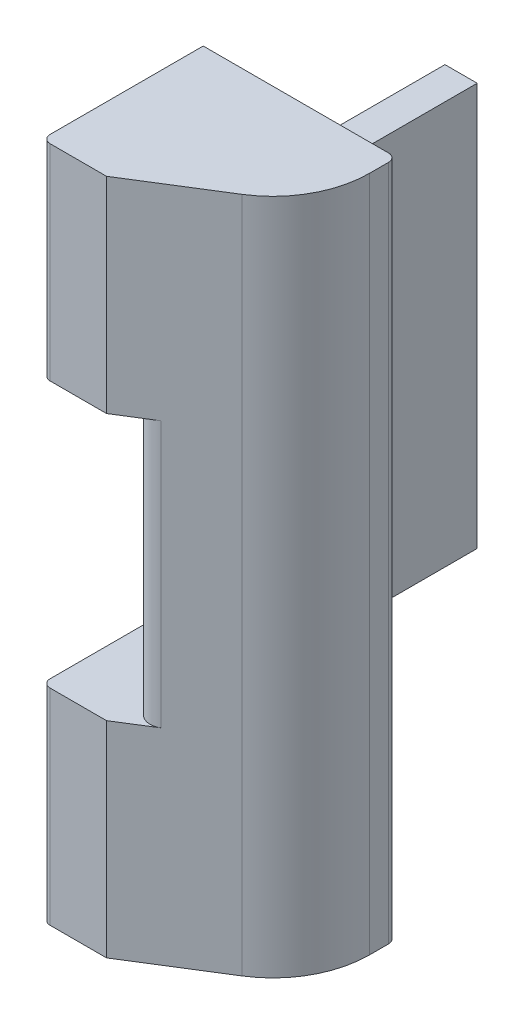
ISO-10303-21;
HEADER;
FILE_DESCRIPTION(('STEP AP214'),'2;1');
FILE_NAME('part.step','',(''),(''),'','','');
FILE_SCHEMA(('AUTOMOTIVE_DESIGN { 1 0 10303 214 1 1 1 1 }'));
ENDSEC;
DATA;
#1=APPLICATION_CONTEXT('core data for automotive mechanical design processes');
#2=APPLICATION_PROTOCOL_DEFINITION('international standard','automotive_design',2000,#1);
#3=PRODUCT_CONTEXT('',#1,'mechanical');
#4=PRODUCT('Part','Part','',(#3));
#5=PRODUCT_RELATED_PRODUCT_CATEGORY('part','',(#4));
#6=PRODUCT_DEFINITION_FORMATION('','',#4);
#7=PRODUCT_DEFINITION_CONTEXT('part definition',#1,'design');
#8=PRODUCT_DEFINITION('design','',#6,#7);
#9=PRODUCT_DEFINITION_SHAPE('','',#8);
#10=(LENGTH_UNIT() NAMED_UNIT(*) SI_UNIT(.MILLI.,.METRE.));
#11=(NAMED_UNIT(*) PLANE_ANGLE_UNIT() SI_UNIT($,.RADIAN.));
#12=(NAMED_UNIT(*) SI_UNIT($,.STERADIAN.) SOLID_ANGLE_UNIT());
#13=UNCERTAINTY_MEASURE_WITH_UNIT(LENGTH_MEASURE(1.E-05),#10,'distance_accuracy_value','');
#14=(GEOMETRIC_REPRESENTATION_CONTEXT(3) GLOBAL_UNCERTAINTY_ASSIGNED_CONTEXT((#13)) GLOBAL_UNIT_ASSIGNED_CONTEXT((#10,
#11,#12)) REPRESENTATION_CONTEXT('',''));
#15=CARTESIAN_POINT('',(0.,0.,0.));
#16=DIRECTION('',(0.,0.,1.));
#17=DIRECTION('',(1.,0.,0.));
#18=AXIS2_PLACEMENT_3D('',#15,#16,#17);
#19=CARTESIAN_POINT('',(0.,0.,0.));
#20=DIRECTION('',(0.,0.,-1.));
#21=DIRECTION('',(-1.,0.,0.));
#22=AXIS2_PLACEMENT_3D('',#19,#20,#21);
#23=PLANE('',#22);
#24=DIRECTION('',(-1.,0.,0.));
#25=VECTOR('',#24,1.);
#26=CARTESIAN_POINT('',(-5.99999999999999,-8.25,0.));
#27=LINE('',#26,#25);
#28=CARTESIAN_POINT('',(5.50000000000001,-8.25000000000001,0.));
#29=VERTEX_POINT('',#28);
#30=CARTESIAN_POINT('',(2.00000000000001,-8.25,0.));
#31=VERTEX_POINT('',#30);
#32=EDGE_CURVE('E50',#29,#31,#27,.T.);
#33=ORIENTED_EDGE('',*,*,#32,.F.);
#34=DIRECTION('',(0.,1.,0.));
#35=VECTOR('',#34,1.);
#36=CARTESIAN_POINT('',(5.50000000000001,-21.,0.));
#37=LINE('',#36,#35);
#38=CARTESIAN_POINT('',(5.50000000000001,-21.,0.));
#39=VERTEX_POINT('',#38);
#40=EDGE_CURVE('E304',#29,#39,#37,.F.);
#41=ORIENTED_EDGE('',*,*,#40,.T.);
#42=DIRECTION('',(1.,0.,0.));
#43=VECTOR('',#42,1.);
#44=CARTESIAN_POINT('',(-5.99999999999999,-21.,0.));
#45=LINE('',#44,#43);
#46=CARTESIAN_POINT('',(-5.99999999999999,-21.,0.));
#47=VERTEX_POINT('',#46);
#48=EDGE_CURVE('E281',#47,#39,#45,.T.);
#49=ORIENTED_EDGE('',*,*,#48,.F.);
#50=DIRECTION('',(0.,-1.,0.));
#51=VECTOR('',#50,1.);
#52=CARTESIAN_POINT('',(-5.99999999999999,-21.,0.));
#53=LINE('',#52,#51);
#54=CARTESIAN_POINT('',(-5.99999999999999,-14.5,0.));
#55=VERTEX_POINT('',#54);
#56=EDGE_CURVE('E279',#55,#47,#53,.T.);
#57=ORIENTED_EDGE('',*,*,#56,.F.);
#58=DIRECTION('',(-1.,0.,0.));
#59=VECTOR('',#58,1.);
#60=CARTESIAN_POINT('',(0.,-14.5,0.));
#61=LINE('',#60,#59);
#62=CARTESIAN_POINT('',(2.00000000000001,-14.5,0.));
#63=VERTEX_POINT('',#62);
#64=EDGE_CURVE('E349',#55,#63,#61,.F.);
#65=ORIENTED_EDGE('',*,*,#64,.T.);
#66=DIRECTION('',(0.,-1.,0.));
#67=VECTOR('',#66,1.);
#68=CARTESIAN_POINT('',(2.00000000000001,-8.25,0.));
#69=LINE('',#68,#67);
#70=EDGE_CURVE('E336',#63,#31,#69,.F.);
#71=ORIENTED_EDGE('',*,*,#70,.T.);
#72=EDGE_LOOP('',(#33,#41,#49,#57,#65,#71));
#73=FACE_BOUND('',#72,.T.);
#74=ADVANCED_FACE('F34',(#73),#23,.T.);
#75=CARTESIAN_POINT('',(-1.99999999999999,30.,10.));
#76=DIRECTION('',(0.52999894000318,0.,0.847998304005088));
#77=DIRECTION('',(0.847998304005088,0.,-0.52999894000318));
#78=AXIS2_PLACEMENT_3D('',#75,#76,#77);
#79=PLANE('',#78);
#80=DIRECTION('',(0.,-1.,0.));
#81=VECTOR('',#80,1.);
#82=CARTESIAN_POINT('',(0.0868344256533013,30.,8.69572848396669));
#83=LINE('',#82,#81);
#84=CARTESIAN_POINT('',(0.0868344256533013,8.25000000000003,8.69572848396669));
#85=VERTEX_POINT('',#84);
#86=CARTESIAN_POINT('',(0.0868344256533012,-8.25,8.69572848396669));
#87=VERTEX_POINT('',#86);
#88=EDGE_CURVE('E238',#85,#87,#83,.T.);
#89=ORIENTED_EDGE('',*,*,#88,.T.);
#90=DIRECTION('',(-0.847998304005088,0.,0.52999894000318));
#91=VECTOR('',#90,1.);
#92=CARTESIAN_POINT('',(-1.99999999999999,-8.25,10.));
#93=LINE('',#92,#91);
#94=CARTESIAN_POINT('',(-1.99999999999999,-8.25,10.));
#95=VERTEX_POINT('',#94);
#96=EDGE_CURVE('E231',#87,#95,#93,.T.);
#97=ORIENTED_EDGE('',*,*,#96,.T.);
#98=DIRECTION('',(0.,-1.,0.));
#99=VECTOR('',#98,1.);
#100=CARTESIAN_POINT('',(-1.99999999999999,0.,10.));
#101=LINE('',#100,#99);
#102=CARTESIAN_POINT('',(-1.99999999999999,-21.,10.));
#103=VERTEX_POINT('',#102);
#104=EDGE_CURVE('E235',#95,#103,#101,.T.);
#105=ORIENTED_EDGE('',*,*,#104,.T.);
#106=DIRECTION('',(0.847998304005088,0.,-0.52999894000318));
#107=VECTOR('',#106,1.);
#108=CARTESIAN_POINT('',(-4.87640449438202,-21.,11.7977528089888));
#109=LINE('',#108,#107);
#110=CARTESIAN_POINT('',(3.17999364001909,-21.,6.76250397498808));
#111=VERTEX_POINT('',#110);
#112=EDGE_CURVE('E459',#103,#111,#109,.T.);
#113=ORIENTED_EDGE('',*,*,#112,.T.);
#114=DIRECTION('',(0.,-1.,0.));
#115=VECTOR('',#114,1.);
#116=CARTESIAN_POINT('',(3.17999364001909,21.,6.76250397498807));
#117=LINE('',#116,#115);
#118=CARTESIAN_POINT('',(3.17999364001909,21.,6.76250397498808));
#119=VERTEX_POINT('',#118);
#120=EDGE_CURVE('E402',#111,#119,#117,.F.);
#121=ORIENTED_EDGE('',*,*,#120,.T.);
#122=DIRECTION('',(-0.847998304005088,0.,0.52999894000318));
#123=VECTOR('',#122,1.);
#124=CARTESIAN_POINT('',(-4.87640449438202,21.,11.7977528089888));
#125=LINE('',#124,#123);
#126=CARTESIAN_POINT('',(-1.99999999999999,21.,10.));
#127=VERTEX_POINT('',#126);
#128=EDGE_CURVE('E270',#119,#127,#125,.T.);
#129=ORIENTED_EDGE('',*,*,#128,.T.);
#130=CARTESIAN_POINT('',(-1.99999999999999,8.25000000000003,10.));
#131=VERTEX_POINT('',#130);
#132=EDGE_CURVE('E249',#127,#131,#101,.T.);
#133=ORIENTED_EDGE('',*,*,#132,.T.);
#134=DIRECTION('',(0.847998304005088,0.,-0.52999894000318));
#135=VECTOR('',#134,1.);
#136=CARTESIAN_POINT('',(-1.99999999999999,8.25000000000003,10.));
#137=LINE('',#136,#135);
#138=EDGE_CURVE('E240',#131,#85,#137,.T.);
#139=ORIENTED_EDGE('',*,*,#138,.T.);
#140=EDGE_LOOP('',(#89,#97,#105,#113,#121,#129,#133,#139));
#141=FACE_BOUND('',#140,.T.);
#142=ADVANCED_FACE('F233',(#141),#79,.T.);
#143=CARTESIAN_POINT('',(-1.99999999999999,8.25,9.));
#144=DIRECTION('',(-0.543627400818268,0.,-0.83932666410616));
#145=DIRECTION('',(-0.83932666410616,0.,0.543627400818268));
#146=AXIS2_PLACEMENT_3D('',#143,#144,#145);
#147=PLANE('',#146);
#148=DIRECTION('',(0.83932666410616,0.,-0.543627400818268));
#149=VECTOR('',#148,1.);
#150=CARTESIAN_POINT('',(-1.99999999999999,-8.25,9.));
#151=LINE('',#150,#149);
#152=CARTESIAN_POINT('',(-0.986791915168148,-8.25,8.34375053099049));
#153=VERTEX_POINT('',#152);
#154=CARTESIAN_POINT('',(4.54362740081827,-8.25,4.76172745611702));
#155=VERTEX_POINT('',#154);
#156=EDGE_CURVE('E559',#153,#155,#151,.T.);
#157=ORIENTED_EDGE('',*,*,#156,.F.);
#158=DIRECTION('',(0.,1.,0.));
#159=VECTOR('',#158,1.);
#160=CARTESIAN_POINT('',(-0.986791915168148,8.25,8.34375053099049));
#161=LINE('',#160,#159);
#162=CARTESIAN_POINT('',(-0.986791915168148,8.25,8.34375053099049));
#163=VERTEX_POINT('',#162);
#164=EDGE_CURVE('E409',#153,#163,#161,.T.);
#165=ORIENTED_EDGE('',*,*,#164,.T.);
#166=DIRECTION('',(0.83932666410616,0.,-0.543627400818268));
#167=VECTOR('',#166,1.);
#168=CARTESIAN_POINT('',(-1.99999999999999,8.25,9.));
#169=LINE('',#168,#167);
#170=CARTESIAN_POINT('',(4.54362740081827,8.25,4.76172745611702));
#171=VERTEX_POINT('',#170);
#172=EDGE_CURVE('E460',#163,#171,#169,.T.);
#173=ORIENTED_EDGE('',*,*,#172,.T.);
#174=DIRECTION('',(0.,-1.,0.));
#175=VECTOR('',#174,1.);
#176=CARTESIAN_POINT('',(4.54362740081828,-8.24999999999999,4.76172745611702));
#177=LINE('',#176,#175);
#178=EDGE_CURVE('E406',#171,#155,#177,.T.);
#179=ORIENTED_EDGE('',*,*,#178,.T.);
#180=EDGE_LOOP('',(#157,#165,#173,#179));
#181=FACE_BOUND('',#180,.T.);
#182=ADVANCED_FACE('F564',(#181),#147,.T.);
#183=CARTESIAN_POINT('',(5.50000000000001,21.,0.));
#184=VERTEX_POINT('',#183);
#185=CARTESIAN_POINT('',(5.50000000000001,8.25000000000003,0.));
#186=VERTEX_POINT('',#185);
#187=EDGE_CURVE('E305',#184,#186,#37,.F.);
#188=ORIENTED_EDGE('',*,*,#187,.T.);
#189=DIRECTION('',(1.,0.,0.));
#190=VECTOR('',#189,1.);
#191=CARTESIAN_POINT('',(-2.,8.25000000000003,0.));
#192=LINE('',#191,#190);
#193=CARTESIAN_POINT('',(2.00000000000001,8.25000000000003,0.));
#194=VERTEX_POINT('',#193);
#195=EDGE_CURVE('E273',#194,#186,#192,.T.);
#196=ORIENTED_EDGE('',*,*,#195,.F.);
#197=DIRECTION('',(0.,-1.,0.));
#198=VECTOR('',#197,1.);
#199=CARTESIAN_POINT('',(2.00000000000001,12.5,0.));
#200=LINE('',#199,#198);
#201=CARTESIAN_POINT('',(2.00000000000001,14.5,0.));
#202=VERTEX_POINT('',#201);
#203=EDGE_CURVE('E338',#194,#202,#200,.F.);
#204=ORIENTED_EDGE('',*,*,#203,.T.);
#205=DIRECTION('',(-1.,0.,0.));
#206=VECTOR('',#205,1.);
#207=CARTESIAN_POINT('',(0.,14.5,0.));
#208=LINE('',#207,#206);
#209=CARTESIAN_POINT('',(-5.99999999999999,14.5,0.));
#210=VERTEX_POINT('',#209);
#211=EDGE_CURVE('E352',#202,#210,#208,.T.);
#212=ORIENTED_EDGE('',*,*,#211,.T.);
#213=DIRECTION('',(0.,-1.,0.));
#214=VECTOR('',#213,1.);
#215=CARTESIAN_POINT('',(-5.99999999999999,8.25000000000003,0.));
#216=LINE('',#215,#214);
#217=CARTESIAN_POINT('',(-5.99999999999999,21.,0.));
#218=VERTEX_POINT('',#217);
#219=EDGE_CURVE('E269',#218,#210,#216,.T.);
#220=ORIENTED_EDGE('',*,*,#219,.F.);
#221=DIRECTION('',(-1.,0.,0.));
#222=VECTOR('',#221,1.);
#223=CARTESIAN_POINT('',(-5.99999999999999,21.,0.));
#224=LINE('',#223,#222);
#225=EDGE_CURVE('E266',#184,#218,#224,.T.);
#226=ORIENTED_EDGE('',*,*,#225,.F.);
#227=EDGE_LOOP('',(#188,#196,#204,#212,#220,#226));
#228=FACE_BOUND('',#227,.T.);
#229=ADVANCED_FACE('F512',(#228),#23,.T.);
#230=CARTESIAN_POINT('',(6.00000000000001,-21.,10.));
#231=DIRECTION('',(-1.,0.,0.));
#232=DIRECTION('',(0.,0.,1.));
#233=AXIS2_PLACEMENT_3D('',#230,#231,#232);
#234=PLANE('',#233);
#235=DIRECTION('',(0.,0.,-1.));
#236=VECTOR('',#235,1.);
#237=CARTESIAN_POINT('',(6.00000000000001,21.,10.));
#238=LINE('',#237,#236);
#239=CARTESIAN_POINT('',(6.00000000000001,21.,1.67451415095755));
#240=VERTEX_POINT('',#239);
#241=CARTESIAN_POINT('',(6.00000000000001,21.,0.5));
#242=VERTEX_POINT('',#241);
#243=EDGE_CURVE('E250',#240,#242,#238,.T.);
#244=ORIENTED_EDGE('',*,*,#243,.F.);
#245=DIRECTION('',(0.,-1.,0.));
#246=VECTOR('',#245,1.);
#247=CARTESIAN_POINT('',(6.00000000000001,-21.,1.67451415095755));
#248=LINE('',#247,#246);
#249=CARTESIAN_POINT('',(6.00000000000001,-21.,1.67451415095755));
#250=VERTEX_POINT('',#249);
#251=EDGE_CURVE('E397',#240,#250,#248,.T.);
#252=ORIENTED_EDGE('',*,*,#251,.T.);
#253=DIRECTION('',(0.,0.,-1.));
#254=VECTOR('',#253,1.);
#255=CARTESIAN_POINT('',(6.00000000000001,-21.,10.));
#256=LINE('',#255,#254);
#257=CARTESIAN_POINT('',(6.00000000000001,-21.,0.5));
#258=VERTEX_POINT('',#257);
#259=EDGE_CURVE('E260',#250,#258,#256,.T.);
#260=ORIENTED_EDGE('',*,*,#259,.T.);
#261=DIRECTION('',(0.,1.,0.));
#262=VECTOR('',#261,1.);
#263=CARTESIAN_POINT('',(6.00000000000001,21.,0.5));
#264=LINE('',#263,#262);
#265=EDGE_CURVE('E297',#258,#242,#264,.T.);
#266=ORIENTED_EDGE('',*,*,#265,.T.);
#267=EDGE_LOOP('',(#244,#252,#260,#266));
#268=FACE_BOUND('',#267,.T.);
#269=ADVANCED_FACE('F520',(#268),#234,.F.);
#270=CARTESIAN_POINT('',(-5.99999999999999,21.,10.));
#271=DIRECTION('',(0.,-1.,0.));
#272=DIRECTION('',(0.,0.,-1.));
#273=AXIS2_PLACEMENT_3D('',#270,#271,#272);
#274=PLANE('',#273);
#275=ORIENTED_EDGE('',*,*,#128,.F.);
#276=CARTESIAN_POINT('',(0.,21.,1.67451415095755));
#277=DIRECTION('',(0.,-1.,0.));
#278=DIRECTION('',(0.,0.,-1.));
#279=AXIS2_PLACEMENT_3D('',#276,#277,#278);
#280=CIRCLE('',#279,6.);
#281=EDGE_CURVE('E404',#119,#240,#280,.F.);
#282=ORIENTED_EDGE('',*,*,#281,.T.);
#283=ORIENTED_EDGE('',*,*,#243,.T.);
#284=CARTESIAN_POINT('',(5.50000000000001,21.,0.5));
#285=DIRECTION('',(0.,-1.,0.));
#286=DIRECTION('',(0.,0.,-1.));
#287=AXIS2_PLACEMENT_3D('',#284,#285,#286);
#288=CIRCLE('',#287,0.5);
#289=EDGE_CURVE('E302',#242,#184,#288,.F.);
#290=ORIENTED_EDGE('',*,*,#289,.T.);
#291=ORIENTED_EDGE('',*,*,#225,.T.);
#292=DIRECTION('',(0.,0.,-1.));
#293=VECTOR('',#292,1.);
#294=CARTESIAN_POINT('',(-5.99999999999999,21.,10.));
#295=LINE('',#294,#293);
#296=CARTESIAN_POINT('',(-5.99999999999999,21.,9.5));
#297=VERTEX_POINT('',#296);
#298=EDGE_CURVE('E294',#297,#218,#295,.T.);
#299=ORIENTED_EDGE('',*,*,#298,.F.);
#300=CARTESIAN_POINT('',(-5.49999999999999,21.,9.5));
#301=DIRECTION('',(0.,-1.,0.));
#302=DIRECTION('',(0.,0.,-1.));
#303=AXIS2_PLACEMENT_3D('',#300,#301,#302);
#304=CIRCLE('',#303,0.5);
#305=CARTESIAN_POINT('',(-5.49999999999999,21.,10.));
#306=VERTEX_POINT('',#305);
#307=EDGE_CURVE('E300',#297,#306,#304,.F.);
#308=ORIENTED_EDGE('',*,*,#307,.T.);
#309=DIRECTION('',(-1.,0.,0.));
#310=VECTOR('',#309,1.);
#311=CARTESIAN_POINT('',(-5.99999999999999,21.,10.));
#312=LINE('',#311,#310);
#313=EDGE_CURVE('E262',#127,#306,#312,.T.);
#314=ORIENTED_EDGE('',*,*,#313,.F.);
#315=EDGE_LOOP('',(#275,#282,#283,#290,#291,#299,#308,#314));
#316=FACE_BOUND('',#315,.T.);
#317=ADVANCED_FACE('F594',(#316),#274,.F.);
#318=CARTESIAN_POINT('',(-5.99999999999999,-21.,10.));
#319=DIRECTION('',(0.,1.,0.));
#320=DIRECTION('',(0.,0.,1.));
#321=AXIS2_PLACEMENT_3D('',#318,#319,#320);
#322=PLANE('',#321);
#323=ORIENTED_EDGE('',*,*,#259,.F.);
#324=CARTESIAN_POINT('',(0.,-21.,1.67451415095755));
#325=DIRECTION('',(0.,1.,0.));
#326=DIRECTION('',(0.,0.,1.));
#327=AXIS2_PLACEMENT_3D('',#324,#325,#326);
#328=CIRCLE('',#327,6.);
#329=EDGE_CURVE('E400',#250,#111,#328,.F.);
#330=ORIENTED_EDGE('',*,*,#329,.T.);
#331=ORIENTED_EDGE('',*,*,#112,.F.);
#332=DIRECTION('',(1.,0.,0.));
#333=VECTOR('',#332,1.);
#334=CARTESIAN_POINT('',(-5.99999999999999,-21.,10.));
#335=LINE('',#334,#333);
#336=CARTESIAN_POINT('',(-5.49999999999999,-21.,10.));
#337=VERTEX_POINT('',#336);
#338=EDGE_CURVE('E248',#337,#103,#335,.T.);
#339=ORIENTED_EDGE('',*,*,#338,.F.);
#340=CARTESIAN_POINT('',(-5.49999999999999,-21.,9.5));
#341=DIRECTION('',(0.,1.,0.));
#342=DIRECTION('',(0.,0.,1.));
#343=AXIS2_PLACEMENT_3D('',#340,#341,#342);
#344=CIRCLE('',#343,0.5);
#345=CARTESIAN_POINT('',(-5.99999999999999,-21.,9.5));
#346=VERTEX_POINT('',#345);
#347=EDGE_CURVE('E308',#337,#346,#344,.F.);
#348=ORIENTED_EDGE('',*,*,#347,.T.);
#349=DIRECTION('',(0.,0.,-1.));
#350=VECTOR('',#349,1.);
#351=CARTESIAN_POINT('',(-5.99999999999999,-21.,10.));
#352=LINE('',#351,#350);
#353=EDGE_CURVE('E285',#346,#47,#352,.T.);
#354=ORIENTED_EDGE('',*,*,#353,.T.);
#355=ORIENTED_EDGE('',*,*,#48,.T.);
#356=CARTESIAN_POINT('',(5.50000000000001,-21.,0.5));
#357=DIRECTION('',(0.,1.,0.));
#358=DIRECTION('',(0.,0.,1.));
#359=AXIS2_PLACEMENT_3D('',#356,#357,#358);
#360=CIRCLE('',#359,0.5);
#361=EDGE_CURVE('E310',#39,#258,#360,.F.);
#362=ORIENTED_EDGE('',*,*,#361,.T.);
#363=EDGE_LOOP('',(#323,#330,#331,#339,#348,#354,#355,#362));
#364=FACE_BOUND('',#363,.T.);
#365=ADVANCED_FACE('F524',(#364),#322,.F.);
#366=CARTESIAN_POINT('',(0.,0.,10.));
#367=DIRECTION('',(0.,0.,-1.));
#368=DIRECTION('',(-1.,0.,0.));
#369=AXIS2_PLACEMENT_3D('',#366,#367,#368);
#370=PLANE('',#369);
#371=ORIENTED_EDGE('',*,*,#313,.T.);
#372=DIRECTION('',(0.,-1.,0.));
#373=VECTOR('',#372,1.);
#374=CARTESIAN_POINT('',(-5.49999999999999,0.,10.));
#375=LINE('',#374,#373);
#376=CARTESIAN_POINT('',(-5.49999999999999,8.25000000000003,10.));
#377=VERTEX_POINT('',#376);
#378=EDGE_CURVE('E318',#306,#377,#375,.T.);
#379=ORIENTED_EDGE('',*,*,#378,.T.);
#380=DIRECTION('',(1.,0.,0.));
#381=VECTOR('',#380,1.);
#382=CARTESIAN_POINT('',(-2.,8.25000000000003,10.));
#383=LINE('',#382,#381);
#384=EDGE_CURVE('E258',#377,#131,#383,.T.);
#385=ORIENTED_EDGE('',*,*,#384,.T.);
#386=ORIENTED_EDGE('',*,*,#132,.F.);
#387=EDGE_LOOP('',(#371,#379,#385,#386));
#388=FACE_BOUND('',#387,.T.);
#389=ADVANCED_FACE('F472',(#388),#370,.F.);
#390=DIRECTION('',(-1.,0.,0.));
#391=VECTOR('',#390,1.);
#392=CARTESIAN_POINT('',(-5.99999999999999,-8.25,10.));
#393=LINE('',#392,#391);
#394=CARTESIAN_POINT('',(-5.49999999999999,-8.25,10.));
#395=VERTEX_POINT('',#394);
#396=EDGE_CURVE('E245',#95,#395,#393,.T.);
#397=ORIENTED_EDGE('',*,*,#396,.T.);
#398=DIRECTION('',(0.,-1.,0.));
#399=VECTOR('',#398,1.);
#400=CARTESIAN_POINT('',(-5.49999999999999,0.,10.));
#401=LINE('',#400,#399);
#402=EDGE_CURVE('E313',#395,#337,#401,.T.);
#403=ORIENTED_EDGE('',*,*,#402,.T.);
#404=ORIENTED_EDGE('',*,*,#338,.T.);
#405=ORIENTED_EDGE('',*,*,#104,.F.);
#406=EDGE_LOOP('',(#397,#403,#404,#405));
#407=FACE_BOUND('',#406,.T.);
#408=ADVANCED_FACE('F243',(#407),#370,.F.);
#409=CARTESIAN_POINT('',(-2.,8.25000000000003,10.));
#410=DIRECTION('',(0.,1.,0.));
#411=DIRECTION('',(-1.,0.,0.));
#412=AXIS2_PLACEMENT_3D('',#409,#410,#411);
#413=PLANE('',#412);
#414=DIRECTION('',(0.,0.,-1.));
#415=VECTOR('',#414,1.);
#416=CARTESIAN_POINT('',(5.00000000000001,8.25,4.46613735930763));
#417=LINE('',#416,#415);
#418=CARTESIAN_POINT('',(5.00000000000001,8.25,3.92240079201086));
#419=VERTEX_POINT('',#418);
#420=CARTESIAN_POINT('',(5.00000000000001,8.25,1.));
#421=VERTEX_POINT('',#420);
#422=EDGE_CURVE('E454',#419,#421,#417,.T.);
#423=ORIENTED_EDGE('',*,*,#422,.F.);
#424=CARTESIAN_POINT('',(4.00000000000001,8.25000000000003,3.92240079201086));
#425=DIRECTION('',(0.,1.,0.));
#426=DIRECTION('',(-1.,0.,0.));
#427=AXIS2_PLACEMENT_3D('',#424,#425,#426);
#428=CIRCLE('',#427,1.);
#429=EDGE_CURVE('E420',#419,#171,#428,.F.);
#430=ORIENTED_EDGE('',*,*,#429,.T.);
#431=ORIENTED_EDGE('',*,*,#172,.F.);
#432=CARTESIAN_POINT('',(-0.443164514349879,8.25000000000003,9.18307719509665));
#433=DIRECTION('',(0.,1.,0.));
#434=DIRECTION('',(-1.,0.,0.));
#435=AXIS2_PLACEMENT_3D('',#432,#433,#434);
#436=CIRCLE('',#435,1.);
#437=CARTESIAN_POINT('',(-1.18761873543569,8.25000000000003,8.51540368752913));
#438=VERTEX_POINT('',#437);
#439=EDGE_CURVE('E431',#163,#438,#436,.T.);
#440=ORIENTED_EDGE('',*,*,#439,.T.);
#441=CARTESIAN_POINT('',(-0.443164514349879,8.25000000000003,7.8477301799616));
#442=DIRECTION('',(0.,1.,0.));
#443=DIRECTION('',(-1.,0.,0.));
#444=AXIS2_PLACEMENT_3D('',#441,#442,#443);
#445=CIRCLE('',#444,1.);
#446=EDGE_CURVE('E436',#438,#85,#445,.T.);
#447=ORIENTED_EDGE('',*,*,#446,.T.);
#448=ORIENTED_EDGE('',*,*,#138,.F.);
#449=ORIENTED_EDGE('',*,*,#384,.F.);
#450=CARTESIAN_POINT('',(-5.49999999999999,8.25000000000003,9.5));
#451=DIRECTION('',(0.,1.,0.));
#452=DIRECTION('',(-1.,0.,0.));
#453=AXIS2_PLACEMENT_3D('',#450,#451,#452);
#454=CIRCLE('',#453,0.5);
#455=CARTESIAN_POINT('',(-5.99999999999999,8.25000000000003,9.5));
#456=VERTEX_POINT('',#455);
#457=EDGE_CURVE('E321',#377,#456,#454,.F.);
#458=ORIENTED_EDGE('',*,*,#457,.T.);
#459=DIRECTION('',(0.,0.,-1.));
#460=VECTOR('',#459,1.);
#461=CARTESIAN_POINT('',(-5.99999999999999,8.25000000000003,10.));
#462=LINE('',#461,#460);
#463=CARTESIAN_POINT('',(-5.99999999999999,8.25000000000003,0.));
#464=VERTEX_POINT('',#463);
#465=EDGE_CURVE('E291',#456,#464,#462,.T.);
#466=ORIENTED_EDGE('',*,*,#465,.T.);
#467=CARTESIAN_POINT('',(-3.99999999999999,8.25000000000001,0.));
#468=VERTEX_POINT('',#467);
#469=EDGE_CURVE('E274',#464,#468,#192,.T.);
#470=ORIENTED_EDGE('',*,*,#469,.T.);
#471=DIRECTION('',(0.,0.,1.));
#472=VECTOR('',#471,1.);
#473=CARTESIAN_POINT('',(-3.99999999999999,8.25000000000003,0.));
#474=LINE('',#473,#472);
#475=CARTESIAN_POINT('',(-3.99999999999999,8.25000000000003,-6.));
#476=VERTEX_POINT('',#475);
#477=EDGE_CURVE('E331',#476,#468,#474,.T.);
#478=ORIENTED_EDGE('',*,*,#477,.F.);
#479=CARTESIAN_POINT('',(2.00000000000001,8.25000000000003,-6.));
#480=DIRECTION('',(0.,1.,0.));
#481=DIRECTION('',(-1.,0.,0.));
#482=AXIS2_PLACEMENT_3D('',#479,#480,#481);
#483=CIRCLE('',#482,6.);
#484=EDGE_CURVE('E340',#476,#194,#483,.T.);
#485=ORIENTED_EDGE('',*,*,#484,.T.);
#486=ORIENTED_EDGE('',*,*,#195,.T.);
#487=CARTESIAN_POINT('',(5.50000000000001,8.25000000000004,0.5));
#488=DIRECTION('',(0.,1.,0.));
#489=DIRECTION('',(-1.,0.,0.));
#490=AXIS2_PLACEMENT_3D('',#487,#488,#489);
#491=CIRCLE('',#490,0.5);
#492=CARTESIAN_POINT('',(5.70571891388308,8.25000000000003,0.0442810861169267));
#493=VERTEX_POINT('',#492);
#494=EDGE_CURVE('E425',#493,#186,#491,.T.);
#495=ORIENTED_EDGE('',*,*,#494,.F.);
#496=CARTESIAN_POINT('',(6.00000000000001,8.25000000000003,1.));
#497=DIRECTION('',(0.,1.,0.));
#498=DIRECTION('',(-1.,0.,0.));
#499=AXIS2_PLACEMENT_3D('',#496,#497,#498);
#500=CIRCLE('',#499,1.);
#501=EDGE_CURVE('E12',#493,#421,#500,.T.);
#502=ORIENTED_EDGE('',*,*,#501,.T.);
#503=EDGE_LOOP('',(#423,#430,#431,#440,#447,#448,#449,#458,#466,#470,#478,#485,#486,#495,#502));
#504=FACE_BOUND('',#503,.T.);
#505=ADVANCED_FACE('F453',(#504),#413,.F.);
#506=CARTESIAN_POINT('',(-5.99999999999999,-8.25,10.));
#507=DIRECTION('',(0.,-1.,0.));
#508=DIRECTION('',(1.,0.,0.));
#509=AXIS2_PLACEMENT_3D('',#506,#507,#508);
#510=PLANE('',#509);
#511=ORIENTED_EDGE('',*,*,#156,.T.);
#512=CARTESIAN_POINT('',(4.00000000000001,-8.25,3.92240079201086));
#513=DIRECTION('',(0.,-1.,0.));
#514=DIRECTION('',(1.,0.,0.));
#515=AXIS2_PLACEMENT_3D('',#512,#513,#514);
#516=CIRCLE('',#515,1.);
#517=CARTESIAN_POINT('',(5.00000000000001,-8.25,3.92240079201086));
#518=VERTEX_POINT('',#517);
#519=EDGE_CURVE('E413',#155,#518,#516,.F.);
#520=ORIENTED_EDGE('',*,*,#519,.T.);
#521=DIRECTION('',(0.,0.,-1.));
#522=VECTOR('',#521,1.);
#523=CARTESIAN_POINT('',(5.00000000000001,-8.25,4.46613735930763));
#524=LINE('',#523,#522);
#525=CARTESIAN_POINT('',(5.00000000000001,-8.25,1.));
#526=VERTEX_POINT('',#525);
#527=EDGE_CURVE('E442',#518,#526,#524,.T.);
#528=ORIENTED_EDGE('',*,*,#527,.T.);
#529=CARTESIAN_POINT('',(6.00000000000001,-8.25000000000001,1.));
#530=DIRECTION('',(0.,-1.,0.));
#531=DIRECTION('',(1.,0.,0.));
#532=AXIS2_PLACEMENT_3D('',#529,#530,#531);
#533=CIRCLE('',#532,1.);
#534=CARTESIAN_POINT('',(5.70571891388308,-8.25000000000001,0.0442810861169263));
#535=VERTEX_POINT('',#534);
#536=EDGE_CURVE('E43',#526,#535,#533,.T.);
#537=ORIENTED_EDGE('',*,*,#536,.T.);
#538=CARTESIAN_POINT('',(5.50000000000001,-8.25000000000001,0.5));
#539=DIRECTION('',(0.,-1.,0.));
#540=DIRECTION('',(1.,0.,0.));
#541=AXIS2_PLACEMENT_3D('',#538,#539,#540);
#542=CIRCLE('',#541,0.5);
#543=EDGE_CURVE('E428',#29,#535,#542,.T.);
#544=ORIENTED_EDGE('',*,*,#543,.F.);
#545=ORIENTED_EDGE('',*,*,#32,.T.);
#546=CARTESIAN_POINT('',(2.00000000000001,-8.25,-6.));
#547=DIRECTION('',(0.,-1.,0.));
#548=DIRECTION('',(1.,0.,0.));
#549=AXIS2_PLACEMENT_3D('',#546,#547,#548);
#550=CIRCLE('',#549,6.);
#551=CARTESIAN_POINT('',(-3.99999999999999,-8.25,-6.));
#552=VERTEX_POINT('',#551);
#553=EDGE_CURVE('E347',#31,#552,#550,.T.);
#554=ORIENTED_EDGE('',*,*,#553,.T.);
#555=DIRECTION('',(0.,0.,-1.));
#556=VECTOR('',#555,1.);
#557=CARTESIAN_POINT('',(-3.99999999999999,-8.25,0.));
#558=LINE('',#557,#556);
#559=CARTESIAN_POINT('',(-3.99999999999999,-8.25,0.));
#560=VERTEX_POINT('',#559);
#561=EDGE_CURVE('E325',#560,#552,#558,.T.);
#562=ORIENTED_EDGE('',*,*,#561,.F.);
#563=CARTESIAN_POINT('',(-5.99999999999999,-8.25,0.));
#564=VERTEX_POINT('',#563);
#565=EDGE_CURVE('E277',#560,#564,#27,.T.);
#566=ORIENTED_EDGE('',*,*,#565,.T.);
#567=DIRECTION('',(0.,0.,-1.));
#568=VECTOR('',#567,1.);
#569=CARTESIAN_POINT('',(-5.99999999999999,-8.25,10.));
#570=LINE('',#569,#568);
#571=CARTESIAN_POINT('',(-5.99999999999999,-8.25,9.5));
#572=VERTEX_POINT('',#571);
#573=EDGE_CURVE('E288',#572,#564,#570,.T.);
#574=ORIENTED_EDGE('',*,*,#573,.F.);
#575=CARTESIAN_POINT('',(-5.49999999999999,-8.25,9.5));
#576=DIRECTION('',(0.,-1.,0.));
#577=DIRECTION('',(1.,0.,0.));
#578=AXIS2_PLACEMENT_3D('',#575,#576,#577);
#579=CIRCLE('',#578,0.5);
#580=EDGE_CURVE('E256',#572,#395,#579,.F.);
#581=ORIENTED_EDGE('',*,*,#580,.T.);
#582=ORIENTED_EDGE('',*,*,#396,.F.);
#583=ORIENTED_EDGE('',*,*,#96,.F.);
#584=CARTESIAN_POINT('',(-0.443164514349879,-8.25,7.8477301799616));
#585=DIRECTION('',(0.,-1.,0.));
#586=DIRECTION('',(1.,0.,0.));
#587=AXIS2_PLACEMENT_3D('',#584,#585,#586);
#588=CIRCLE('',#587,1.);
#589=CARTESIAN_POINT('',(-1.18761873543569,-8.25,8.51540368752913));
#590=VERTEX_POINT('',#589);
#591=EDGE_CURVE('E58',#87,#590,#588,.T.);
#592=ORIENTED_EDGE('',*,*,#591,.T.);
#593=CARTESIAN_POINT('',(-0.443164514349879,-8.25,9.18307719509665));
#594=DIRECTION('',(0.,-1.,0.));
#595=DIRECTION('',(1.,0.,0.));
#596=AXIS2_PLACEMENT_3D('',#593,#594,#595);
#597=CIRCLE('',#596,1.);
#598=EDGE_CURVE('E433',#590,#153,#597,.T.);
#599=ORIENTED_EDGE('',*,*,#598,.T.);
#600=EDGE_LOOP('',(#511,#520,#528,#537,#544,#545,#554,#562,#566,#574,#581,#582,#583,#592,#599));
#601=FACE_BOUND('',#600,.T.);
#602=ADVANCED_FACE('F253',(#601),#510,.F.);
#603=CARTESIAN_POINT('',(-5.99999999999999,-21.,10.));
#604=DIRECTION('',(1.,0.,0.));
#605=DIRECTION('',(0.,0.,-1.));
#606=AXIS2_PLACEMENT_3D('',#603,#604,#605);
#607=PLANE('',#606);
#608=ORIENTED_EDGE('',*,*,#353,.F.);
#609=DIRECTION('',(0.,-1.,0.));
#610=VECTOR('',#609,1.);
#611=CARTESIAN_POINT('',(-5.99999999999999,-21.,9.5));
#612=LINE('',#611,#610);
#613=EDGE_CURVE('E315',#346,#572,#612,.F.);
#614=ORIENTED_EDGE('',*,*,#613,.T.);
#615=ORIENTED_EDGE('',*,*,#573,.T.);
#616=DIRECTION('',(0.,-1.,0.));
#617=VECTOR('',#616,1.);
#618=CARTESIAN_POINT('',(-5.99999999999999,-21.,0.));
#619=LINE('',#618,#617);
#620=EDGE_CURVE('E487',#464,#564,#619,.T.);
#621=ORIENTED_EDGE('',*,*,#620,.F.);
#622=ORIENTED_EDGE('',*,*,#465,.F.);
#623=DIRECTION('',(0.,-1.,0.));
#624=VECTOR('',#623,1.);
#625=CARTESIAN_POINT('',(-5.99999999999999,8.25000000000003,9.5));
#626=LINE('',#625,#624);
#627=EDGE_CURVE('E323',#456,#297,#626,.F.);
#628=ORIENTED_EDGE('',*,*,#627,.T.);
#629=ORIENTED_EDGE('',*,*,#298,.T.);
#630=ORIENTED_EDGE('',*,*,#219,.T.);
#631=CARTESIAN_POINT('',(-5.99999999999999,14.5,-2.));
#632=DIRECTION('',(1.,0.,0.));
#633=DIRECTION('',(0.,0.,-1.));
#634=AXIS2_PLACEMENT_3D('',#631,#632,#633);
#635=CIRCLE('',#634,2.);
#636=CARTESIAN_POINT('',(-5.99999999999999,12.5,-2.));
#637=VERTEX_POINT('',#636);
#638=EDGE_CURVE('E360',#210,#637,#635,.T.);
#639=ORIENTED_EDGE('',*,*,#638,.T.);
#640=DIRECTION('',(0.,0.,1.));
#641=VECTOR('',#640,1.);
#642=CARTESIAN_POINT('',(-5.99999999999999,12.5,10.));
#643=LINE('',#642,#641);
#644=CARTESIAN_POINT('',(-5.99999999999999,12.5,-15.));
#645=VERTEX_POINT('',#644);
#646=EDGE_CURVE('E545',#645,#637,#643,.T.);
#647=ORIENTED_EDGE('',*,*,#646,.F.);
#648=DIRECTION('',(0.,1.,0.));
#649=VECTOR('',#648,1.);
#650=CARTESIAN_POINT('',(-5.99999999999999,-21.,-15.));
#651=LINE('',#650,#649);
#652=CARTESIAN_POINT('',(-5.99999999999999,-12.5,-15.));
#653=VERTEX_POINT('',#652);
#654=EDGE_CURVE('E552',#653,#645,#651,.T.);
#655=ORIENTED_EDGE('',*,*,#654,.F.);
#656=DIRECTION('',(0.,0.,-1.));
#657=VECTOR('',#656,1.);
#658=CARTESIAN_POINT('',(-5.99999999999999,-12.5,10.));
#659=LINE('',#658,#657);
#660=CARTESIAN_POINT('',(-5.99999999999999,-12.5,-2.));
#661=VERTEX_POINT('',#660);
#662=EDGE_CURVE('E492',#661,#653,#659,.T.);
#663=ORIENTED_EDGE('',*,*,#662,.F.);
#664=CARTESIAN_POINT('',(-5.99999999999999,-14.5,-2.));
#665=DIRECTION('',(1.,0.,0.));
#666=DIRECTION('',(0.,0.,-1.));
#667=AXIS2_PLACEMENT_3D('',#664,#665,#666);
#668=CIRCLE('',#667,2.);
#669=EDGE_CURVE('E371',#661,#55,#668,.T.);
#670=ORIENTED_EDGE('',*,*,#669,.T.);
#671=ORIENTED_EDGE('',*,*,#56,.T.);
#672=EDGE_LOOP('',(#608,#614,#615,#621,#622,#628,#629,#630,#639,#647,#655,#663,#670,#671));
#673=FACE_BOUND('',#672,.T.);
#674=ADVANCED_FACE('F485',(#673),#607,.F.);
#675=CARTESIAN_POINT('',(5.00000000000001,8.25,4.46613735930763));
#676=DIRECTION('',(-1.,0.,0.));
#677=DIRECTION('',(0.,0.,1.));
#678=AXIS2_PLACEMENT_3D('',#675,#676,#677);
#679=PLANE('',#678);
#680=ORIENTED_EDGE('',*,*,#527,.F.);
#681=DIRECTION('',(0.,-1.,0.));
#682=VECTOR('',#681,1.);
#683=CARTESIAN_POINT('',(5.00000000000001,8.25,3.92240079201086));
#684=LINE('',#683,#682);
#685=EDGE_CURVE('E418',#518,#419,#684,.F.);
#686=ORIENTED_EDGE('',*,*,#685,.T.);
#687=ORIENTED_EDGE('',*,*,#422,.T.);
#688=DIRECTION('',(0.,-1.,0.));
#689=VECTOR('',#688,1.);
#690=CARTESIAN_POINT('',(5.00000000000001,8.25,1.));
#691=LINE('',#690,#689);
#692=EDGE_CURVE('E415',#421,#526,#691,.T.);
#693=ORIENTED_EDGE('',*,*,#692,.T.);
#694=EDGE_LOOP('',(#680,#686,#687,#693));
#695=FACE_BOUND('',#694,.T.);
#696=ADVANCED_FACE('F457',(#695),#679,.T.);
#697=CARTESIAN_POINT('',(5.50000000000001,-21.,0.5));
#698=DIRECTION('',(0.,-1.,0.));
#699=DIRECTION('',(0.,0.,-1.));
#700=AXIS2_PLACEMENT_3D('',#697,#698,#699);
#701=CYLINDRICAL_SURFACE('',#700,0.5);
#702=ORIENTED_EDGE('',*,*,#40,.F.);
#703=ORIENTED_EDGE('',*,*,#543,.T.);
#704=DIRECTION('',(0.,-1.,0.));
#705=VECTOR('',#704,1.);
#706=CARTESIAN_POINT('',(5.70571891388308,0.,0.0442810861169267));
#707=LINE('',#706,#705);
#708=EDGE_CURVE('E422',#535,#493,#707,.F.);
#709=ORIENTED_EDGE('',*,*,#708,.T.);
#710=ORIENTED_EDGE('',*,*,#494,.T.);
#711=ORIENTED_EDGE('',*,*,#187,.F.);
#712=ORIENTED_EDGE('',*,*,#289,.F.);
#713=ORIENTED_EDGE('',*,*,#265,.F.);
#714=ORIENTED_EDGE('',*,*,#361,.F.);
#715=EDGE_LOOP('',(#702,#703,#709,#710,#711,#712,#713,#714));
#716=FACE_BOUND('',#715,.T.);
#717=ADVANCED_FACE('F447',(#716),#701,.T.);
#718=CARTESIAN_POINT('',(-5.49999999999999,0.,9.5));
#719=DIRECTION('',(0.,-1.,0.));
#720=DIRECTION('',(0.,0.,-1.));
#721=AXIS2_PLACEMENT_3D('',#718,#719,#720);
#722=CYLINDRICAL_SURFACE('',#721,0.5);
#723=ORIENTED_EDGE('',*,*,#580,.F.);
#724=ORIENTED_EDGE('',*,*,#613,.F.);
#725=ORIENTED_EDGE('',*,*,#347,.F.);
#726=ORIENTED_EDGE('',*,*,#402,.F.);
#727=EDGE_LOOP('',(#723,#724,#725,#726));
#728=FACE_BOUND('',#727,.T.);
#729=ADVANCED_FACE('F619',(#728),#722,.T.);
#730=CARTESIAN_POINT('',(-5.49999999999999,0.,9.5));
#731=DIRECTION('',(0.,-1.,0.));
#732=DIRECTION('',(0.,0.,-1.));
#733=AXIS2_PLACEMENT_3D('',#730,#731,#732);
#734=CYLINDRICAL_SURFACE('',#733,0.5);
#735=ORIENTED_EDGE('',*,*,#307,.F.);
#736=ORIENTED_EDGE('',*,*,#627,.F.);
#737=ORIENTED_EDGE('',*,*,#457,.F.);
#738=ORIENTED_EDGE('',*,*,#378,.F.);
#739=EDGE_LOOP('',(#735,#736,#737,#738));
#740=FACE_BOUND('',#739,.T.);
#741=ADVANCED_FACE('F479',(#740),#734,.T.);
#742=CARTESIAN_POINT('',(-3.99999999999999,-21.,0.));
#743=DIRECTION('',(0.,0.,-1.));
#744=DIRECTION('',(0.,1.,0.));
#745=AXIS2_PLACEMENT_3D('',#742,#743,#744);
#746=PLANE('',#745);
#747=DIRECTION('',(0.,-1.,0.));
#748=VECTOR('',#747,1.);
#749=CARTESIAN_POINT('',(-3.99999999999999,-21.,0.));
#750=LINE('',#749,#748);
#751=EDGE_CURVE('E497',#468,#560,#750,.T.);
#752=ORIENTED_EDGE('',*,*,#751,.F.);
#753=ORIENTED_EDGE('',*,*,#469,.F.);
#754=ORIENTED_EDGE('',*,*,#620,.T.);
#755=ORIENTED_EDGE('',*,*,#565,.F.);
#756=EDGE_LOOP('',(#752,#753,#754,#755));
#757=FACE_BOUND('',#756,.T.);
#758=ADVANCED_FACE('F495',(#757),#746,.F.);
#759=CARTESIAN_POINT('',(-3.99999999999999,-12.5,10.));
#760=DIRECTION('',(0.,1.,0.));
#761=DIRECTION('',(0.,0.,1.));
#762=AXIS2_PLACEMENT_3D('',#759,#760,#761);
#763=PLANE('',#762);
#764=CARTESIAN_POINT('',(2.00000000000001,-12.5,-6.));
#765=DIRECTION('',(0.,1.,0.));
#766=DIRECTION('',(0.,0.,1.));
#767=AXIS2_PLACEMENT_3D('',#764,#765,#766);
#768=CIRCLE('',#767,6.);
#769=CARTESIAN_POINT('',(-3.99999999999999,-12.5,-6.));
#770=VERTEX_POINT('',#769);
#771=CARTESIAN_POINT('',(-2.47213595499957,-12.5,-2.));
#772=VERTEX_POINT('',#771);
#773=EDGE_CURVE('E344',#770,#772,#768,.T.);
#774=ORIENTED_EDGE('',*,*,#773,.T.);
#775=DIRECTION('',(-1.,0.,0.));
#776=VECTOR('',#775,1.);
#777=CARTESIAN_POINT('',(-3.99999999999999,-12.5,-2.));
#778=LINE('',#777,#776);
#779=EDGE_CURVE('E357',#772,#661,#778,.T.);
#780=ORIENTED_EDGE('',*,*,#779,.T.);
#781=ORIENTED_EDGE('',*,*,#662,.T.);
#782=DIRECTION('',(-1.,0.,0.));
#783=VECTOR('',#782,1.);
#784=CARTESIAN_POINT('',(-3.99999999999999,-12.5,-15.));
#785=LINE('',#784,#783);
#786=CARTESIAN_POINT('',(-3.99999999999999,-12.5,-15.));
#787=VERTEX_POINT('',#786);
#788=EDGE_CURVE('E540',#787,#653,#785,.T.);
#789=ORIENTED_EDGE('',*,*,#788,.F.);
#790=DIRECTION('',(0.,0.,-1.));
#791=VECTOR('',#790,1.);
#792=CARTESIAN_POINT('',(-3.99999999999999,-12.5,10.));
#793=LINE('',#792,#791);
#794=EDGE_CURVE('E538',#770,#787,#793,.T.);
#795=ORIENTED_EDGE('',*,*,#794,.F.);
#796=EDGE_LOOP('',(#774,#780,#781,#789,#795));
#797=FACE_BOUND('',#796,.T.);
#798=ADVANCED_FACE('F535',(#797),#763,.F.);
#799=CARTESIAN_POINT('',(-3.99999999999999,-21.,-15.));
#800=DIRECTION('',(0.,0.,1.));
#801=DIRECTION('',(0.,-1.,0.));
#802=AXIS2_PLACEMENT_3D('',#799,#800,#801);
#803=PLANE('',#802);
#804=ORIENTED_EDGE('',*,*,#654,.T.);
#805=DIRECTION('',(-1.,0.,0.));
#806=VECTOR('',#805,1.);
#807=CARTESIAN_POINT('',(-3.99999999999999,12.5,-15.));
#808=LINE('',#807,#806);
#809=CARTESIAN_POINT('',(-3.99999999999999,12.5,-15.));
#810=VERTEX_POINT('',#809);
#811=EDGE_CURVE('E549',#810,#645,#808,.T.);
#812=ORIENTED_EDGE('',*,*,#811,.F.);
#813=DIRECTION('',(0.,1.,0.));
#814=VECTOR('',#813,1.);
#815=CARTESIAN_POINT('',(-3.99999999999999,-21.,-15.));
#816=LINE('',#815,#814);
#817=EDGE_CURVE('E542',#787,#810,#816,.T.);
#818=ORIENTED_EDGE('',*,*,#817,.F.);
#819=ORIENTED_EDGE('',*,*,#788,.T.);
#820=EDGE_LOOP('',(#804,#812,#818,#819));
#821=FACE_BOUND('',#820,.T.);
#822=ADVANCED_FACE('F629',(#821),#803,.F.);
#823=CARTESIAN_POINT('',(-3.99999999999999,12.5,10.));
#824=DIRECTION('',(0.,-1.,0.));
#825=DIRECTION('',(0.,0.,-1.));
#826=AXIS2_PLACEMENT_3D('',#823,#824,#825);
#827=PLANE('',#826);
#828=ORIENTED_EDGE('',*,*,#646,.T.);
#829=DIRECTION('',(-1.,0.,0.));
#830=VECTOR('',#829,1.);
#831=CARTESIAN_POINT('',(-3.99999999999999,12.5,-2.));
#832=LINE('',#831,#830);
#833=CARTESIAN_POINT('',(-2.47213595499957,12.5,-2.));
#834=VERTEX_POINT('',#833);
#835=EDGE_CURVE('E355',#637,#834,#832,.F.);
#836=ORIENTED_EDGE('',*,*,#835,.T.);
#837=CARTESIAN_POINT('',(2.00000000000001,12.5,-6.));
#838=DIRECTION('',(0.,-1.,0.));
#839=DIRECTION('',(0.,0.,-1.));
#840=AXIS2_PLACEMENT_3D('',#837,#838,#839);
#841=CIRCLE('',#840,6.);
#842=CARTESIAN_POINT('',(-3.99999999999999,12.5,-6.));
#843=VERTEX_POINT('',#842);
#844=EDGE_CURVE('E342',#834,#843,#841,.T.);
#845=ORIENTED_EDGE('',*,*,#844,.T.);
#846=DIRECTION('',(0.,0.,1.));
#847=VECTOR('',#846,1.);
#848=CARTESIAN_POINT('',(-3.99999999999999,12.5,10.));
#849=LINE('',#848,#847);
#850=EDGE_CURVE('E505',#810,#843,#849,.T.);
#851=ORIENTED_EDGE('',*,*,#850,.F.);
#852=ORIENTED_EDGE('',*,*,#811,.T.);
#853=EDGE_LOOP('',(#828,#836,#845,#851,#852));
#854=FACE_BOUND('',#853,.T.);
#855=ADVANCED_FACE('F634',(#854),#827,.F.);
#856=CARTESIAN_POINT('',(-3.99999999999999,0.,0.));
#857=DIRECTION('',(1.,0.,0.));
#858=DIRECTION('',(0.,0.,-1.));
#859=AXIS2_PLACEMENT_3D('',#856,#857,#858);
#860=PLANE('',#859);
#861=ORIENTED_EDGE('',*,*,#850,.T.);
#862=DIRECTION('',(0.,-1.,0.));
#863=VECTOR('',#862,1.);
#864=CARTESIAN_POINT('',(-3.99999999999999,8.25000000000001,-6.));
#865=LINE('',#864,#863);
#866=EDGE_CURVE('E333',#843,#476,#865,.T.);
#867=ORIENTED_EDGE('',*,*,#866,.T.);
#868=ORIENTED_EDGE('',*,*,#477,.T.);
#869=ORIENTED_EDGE('',*,*,#751,.T.);
#870=ORIENTED_EDGE('',*,*,#561,.T.);
#871=DIRECTION('',(0.,-1.,0.));
#872=VECTOR('',#871,1.);
#873=CARTESIAN_POINT('',(-3.99999999999999,-12.5,-6.));
#874=LINE('',#873,#872);
#875=EDGE_CURVE('E328',#552,#770,#874,.T.);
#876=ORIENTED_EDGE('',*,*,#875,.T.);
#877=ORIENTED_EDGE('',*,*,#794,.T.);
#878=ORIENTED_EDGE('',*,*,#817,.T.);
#879=EDGE_LOOP('',(#861,#867,#868,#869,#870,#876,#877,#878));
#880=FACE_BOUND('',#879,.T.);
#881=ADVANCED_FACE('F503',(#880),#860,.T.);
#882=CARTESIAN_POINT('',(2.00000000000001,0.,-6.));
#883=DIRECTION('',(0.,1.,0.));
#884=DIRECTION('',(0.,0.,1.));
#885=AXIS2_PLACEMENT_3D('',#882,#883,#884);
#886=CYLINDRICAL_SURFACE('',#885,6.);
#887=ORIENTED_EDGE('',*,*,#844,.F.);
#888=CARTESIAN_POINT('',(-2.47213595499957,12.5,-2.));
#889=CARTESIAN_POINT('',(-2.41551001458986,12.5000088546047,-1.93668129763256));
#890=CARTESIAN_POINT('',(-2.35757490724649,12.5030051309353,-1.87462366877086));
#891=CARTESIAN_POINT('',(-2.23945720314334,12.5143340890306,-1.75333721636062));
#892=CARTESIAN_POINT('',(-2.17927755669298,12.5226599830276,-1.69410489747292));
#893=CARTESIAN_POINT('',(-1.99663128893197,12.5545279354103,-1.52174164707394));
#894=CARTESIAN_POINT('',(-1.87119247322535,12.584980079402,-1.4129810882708));
#895=CARTESIAN_POINT('',(-1.63656121736835,12.6537514006293,-1.22569427708192));
#896=CARTESIAN_POINT('',(-1.52825469922962,12.6898375430924,-1.14517720768094));
#897=CARTESIAN_POINT('',(-1.30847306947017,12.7699738543317,-0.992817245325731));
#898=CARTESIAN_POINT('',(-1.19699666084975,12.8140273237331,-0.920977967970891));
#899=CARTESIAN_POINT('',(-0.970979476774925,12.9087980003019,-0.785525492819742));
#900=CARTESIAN_POINT('',(-0.856425025604075,12.9595511808272,-0.721960669486123));
#901=CARTESIAN_POINT('',(-0.625357129126118,13.0662651744121,-0.60329978286514));
#902=CARTESIAN_POINT('',(-0.508843139773716,13.1222274539531,-0.548206116049978));
#903=CARTESIAN_POINT('',(-0.224623662299204,13.2628808284017,-0.424680671736155));
#904=CARTESIAN_POINT('',(-0.0561277522320749,13.349704708743,-0.360475855771789));
#905=CARTESIAN_POINT('',(0.283053979048216,13.5293450901523,-0.248127639856693));
#906=CARTESIAN_POINT('',(0.453740858449959,13.6221645814787,-0.19999232940984));
#907=CARTESIAN_POINT('',(0.796108314686921,13.8115967424193,-0.119396786374596));
#908=CARTESIAN_POINT('',(0.96778542774023,13.9081995507474,-0.086898399345278));
#909=CARTESIAN_POINT('',(1.31188568594226,14.1037379867971,-0.0370556033319103));
#910=CARTESIAN_POINT('',(1.48430840390968,14.2026723942407,-0.0197034406063992));
#911=CARTESIAN_POINT('',(1.76674083594772,14.3653342230153,-0.00352642992777636));
#912=CARTESIAN_POINT('',(1.87666649155076,14.4287936182809,-0.000260756885545136));
#913=CARTESIAN_POINT('',(1.99105574094241,14.4948360294253,-5.001017021641E-06));
#914=CARTESIAN_POINT('',(1.99552787977365,14.4974180199811,-1.17356595906071E-09));
#915=CARTESIAN_POINT('',(2.00000000000001,14.5,0.));
#916=B_SPLINE_CURVE_WITH_KNOTS('',3,(#888,#889,#890,#891,#892,#893,#894,#895,#896,#897,#898,
#899,#900,#901,#902,#903,#904,#905,#906,#907,#908,#909,#910,#911,#912,#913,#914,#915),
.UNSPECIFIED.,.F.,.F.,(4,2,2,2,2,2,2,2,2,2,2,2,2,4),(0.,0.254656164673896,0.508988644388213,
1.01380551744409,1.43237270077516,1.85111368282126,2.27220218943975,2.69340960279203,
3.2929285483212,3.89274884246919,4.49109804491925,5.0891407570863,5.46990347546763,
5.48539541611433),.UNSPECIFIED.);
#917=EDGE_CURVE('E362',#834,#202,#916,.T.);
#918=ORIENTED_EDGE('',*,*,#917,.T.);
#919=ORIENTED_EDGE('',*,*,#203,.F.);
#920=ORIENTED_EDGE('',*,*,#484,.F.);
#921=ORIENTED_EDGE('',*,*,#866,.F.);
#922=EDGE_LOOP('',(#887,#918,#919,#920,#921));
#923=FACE_BOUND('',#922,.T.);
#924=ADVANCED_FACE('F373',(#923),#886,.F.);
#925=CARTESIAN_POINT('',(2.00000000000001,0.,-6.));
#926=DIRECTION('',(0.,1.,0.));
#927=DIRECTION('',(0.,0.,1.));
#928=AXIS2_PLACEMENT_3D('',#925,#926,#927);
#929=CYLINDRICAL_SURFACE('',#928,6.);
#930=ORIENTED_EDGE('',*,*,#553,.F.);
#931=ORIENTED_EDGE('',*,*,#70,.F.);
#932=CARTESIAN_POINT('',(-2.47213595499957,-12.5,-2.));
#933=CARTESIAN_POINT('',(-2.41551001458986,-12.5000088546048,-1.93668129763256));
#934=CARTESIAN_POINT('',(-2.3575749072465,-12.5030051309353,-1.87462366877086));
#935=CARTESIAN_POINT('',(-2.23945720314335,-12.5143340890306,-1.75333721636063));
#936=CARTESIAN_POINT('',(-2.179277556693,-12.5226599830277,-1.69410489747294));
#937=CARTESIAN_POINT('',(-1.99663128893198,-12.5545279354103,-1.52174164707395));
#938=CARTESIAN_POINT('',(-1.87119247322535,-12.584980079402,-1.41298108827081));
#939=CARTESIAN_POINT('',(-1.63656121736835,-12.6537514006293,-1.22569427708191));
#940=CARTESIAN_POINT('',(-1.52825469922961,-12.6898375430924,-1.14517720768093));
#941=CARTESIAN_POINT('',(-1.30847306947016,-12.7699738543317,-0.992817245325723));
#942=CARTESIAN_POINT('',(-1.19699666084974,-12.8140273237331,-0.920977967970882));
#943=CARTESIAN_POINT('',(-0.970979476774907,-12.9087980003019,-0.785525492819733));
#944=CARTESIAN_POINT('',(-0.85642502560406,-12.9595511808272,-0.721960669486115));
#945=CARTESIAN_POINT('',(-0.62535712912611,-13.0662651744121,-0.603299782865136));
#946=CARTESIAN_POINT('',(-0.508843139773712,-13.1222274539531,-0.548206116049975));
#947=CARTESIAN_POINT('',(-0.224623662299204,-13.2628808284017,-0.424680671736155));
#948=CARTESIAN_POINT('',(-0.056127752232073,-13.3497047087429,-0.36047585577179));
#949=CARTESIAN_POINT('',(0.283053979048203,-13.5293450901523,-0.248127639856696));
#950=CARTESIAN_POINT('',(0.453740858449929,-13.6221645814787,-0.199992329409844));
#951=CARTESIAN_POINT('',(0.796108314686921,-13.8115967424193,-0.119396786374599));
#952=CARTESIAN_POINT('',(0.967785427740277,-13.9081995507473,-0.0868983993452808));
#953=CARTESIAN_POINT('',(1.31188568594219,-14.1037379867972,-0.0370556033319117));
#954=CARTESIAN_POINT('',(1.48430840390944,-14.2026723942411,-0.0197034406063999));
#955=CARTESIAN_POINT('',(1.76674083594787,-14.365334223015,-0.00352642992777695));
#956=CARTESIAN_POINT('',(1.87666649155121,-14.4287936182801,-0.000260756885545923));
#957=CARTESIAN_POINT('',(1.99105574094244,-14.4948360294252,-5.00101702170144E-06));
#958=CARTESIAN_POINT('',(1.99552787977366,-14.4974180199811,-1.17356598967414E-09));
#959=CARTESIAN_POINT('',(2.00000000000001,-14.5,0.));
#960=B_SPLINE_CURVE_WITH_KNOTS('',3,(#932,#933,#934,#935,#936,#937,#938,#939,#940,#941,#942,
#943,#944,#945,#946,#947,#948,#949,#950,#951,#952,#953,#954,#955,#956,#957,#958,#959),
.UNSPECIFIED.,.F.,.F.,(4,2,2,2,2,2,2,2,2,2,2,2,2,4),(0.,0.254656164673885,0.508988644388191,
1.01380551744409,1.43237270077517,1.85111368282128,2.27220218943977,2.69340960279203,
3.29292854832119,3.89274884246916,4.49109804491923,5.08914075708629,5.46990347546763,
5.48539541611433),.UNSPECIFIED.);
#961=EDGE_CURVE('E391',#63,#772,#960,.F.);
#962=ORIENTED_EDGE('',*,*,#961,.T.);
#963=ORIENTED_EDGE('',*,*,#773,.F.);
#964=ORIENTED_EDGE('',*,*,#875,.F.);
#965=EDGE_LOOP('',(#930,#931,#962,#963,#964));
#966=FACE_BOUND('',#965,.T.);
#967=ADVANCED_FACE('F382',(#966),#929,.F.);
#968=CARTESIAN_POINT('',(0.,14.5,-2.));
#969=DIRECTION('',(-1.,0.,0.));
#970=DIRECTION('',(0.,0.,1.));
#971=AXIS2_PLACEMENT_3D('',#968,#969,#970);
#972=CYLINDRICAL_SURFACE('',#971,2.);
#973=ORIENTED_EDGE('',*,*,#917,.F.);
#974=ORIENTED_EDGE('',*,*,#835,.F.);
#975=ORIENTED_EDGE('',*,*,#638,.F.);
#976=ORIENTED_EDGE('',*,*,#211,.F.);
#977=EDGE_LOOP('',(#973,#974,#975,#976));
#978=FACE_BOUND('',#977,.T.);
#979=ADVANCED_FACE('F377',(#978),#972,.F.);
#980=CARTESIAN_POINT('',(-3.99999999999999,-14.5,-2.));
#981=DIRECTION('',(-1.,0.,0.));
#982=DIRECTION('',(0.,0.,1.));
#983=AXIS2_PLACEMENT_3D('',#980,#981,#982);
#984=CYLINDRICAL_SURFACE('',#983,2.);
#985=ORIENTED_EDGE('',*,*,#961,.F.);
#986=ORIENTED_EDGE('',*,*,#64,.F.);
#987=ORIENTED_EDGE('',*,*,#669,.F.);
#988=ORIENTED_EDGE('',*,*,#779,.F.);
#989=EDGE_LOOP('',(#985,#986,#987,#988));
#990=FACE_BOUND('',#989,.T.);
#991=ADVANCED_FACE('F381',(#990),#984,.F.);
#992=CARTESIAN_POINT('',(0.,-21.,1.67451415095755));
#993=DIRECTION('',(0.,1.,0.));
#994=DIRECTION('',(0.,0.,1.));
#995=AXIS2_PLACEMENT_3D('',#992,#993,#994);
#996=CYLINDRICAL_SURFACE('',#995,6.);
#997=ORIENTED_EDGE('',*,*,#281,.F.);
#998=ORIENTED_EDGE('',*,*,#120,.F.);
#999=ORIENTED_EDGE('',*,*,#329,.F.);
#1000=ORIENTED_EDGE('',*,*,#251,.F.);
#1001=EDGE_LOOP('',(#997,#998,#999,#1000));
#1002=FACE_BOUND('',#1001,.T.);
#1003=ADVANCED_FACE('F388',(#1002),#996,.T.);
#1004=CARTESIAN_POINT('',(-0.443164514349879,30.,7.8477301799616));
#1005=DIRECTION('',(0.,-1.,0.));
#1006=DIRECTION('',(0.,0.,-1.));
#1007=AXIS2_PLACEMENT_3D('',#1004,#1005,#1006);
#1008=CYLINDRICAL_SURFACE('',#1007,1.);
#1009=DIRECTION('',(0.,-1.,0.));
#1010=VECTOR('',#1009,1.);
#1011=CARTESIAN_POINT('',(-1.18761873543569,0.,8.51540368752913));
#1012=LINE('',#1011,#1010);
#1013=EDGE_CURVE('E38',#590,#438,#1012,.F.);
#1014=ORIENTED_EDGE('',*,*,#1013,.F.);
#1015=ORIENTED_EDGE('',*,*,#591,.F.);
#1016=ORIENTED_EDGE('',*,*,#88,.F.);
#1017=ORIENTED_EDGE('',*,*,#446,.F.);
#1018=EDGE_LOOP('',(#1014,#1015,#1016,#1017));
#1019=FACE_BOUND('',#1018,.T.);
#1020=ADVANCED_FACE('F572',(#1019),#1008,.T.);
#1021=CARTESIAN_POINT('',(-0.443164514349879,8.25,9.18307719509665));
#1022=DIRECTION('',(0.,1.,0.));
#1023=DIRECTION('',(0.,0.,1.));
#1024=AXIS2_PLACEMENT_3D('',#1021,#1022,#1023);
#1025=CYLINDRICAL_SURFACE('',#1024,1.);
#1026=ORIENTED_EDGE('',*,*,#598,.F.);
#1027=ORIENTED_EDGE('',*,*,#1013,.T.);
#1028=ORIENTED_EDGE('',*,*,#439,.F.);
#1029=ORIENTED_EDGE('',*,*,#164,.F.);
#1030=EDGE_LOOP('',(#1026,#1027,#1028,#1029));
#1031=FACE_BOUND('',#1030,.T.);
#1032=ADVANCED_FACE('F568',(#1031),#1025,.T.);
#1033=CARTESIAN_POINT('',(4.00000000000001,8.25,3.92240079201086));
#1034=DIRECTION('',(0.,1.,0.));
#1035=DIRECTION('',(0.,0.,1.));
#1036=AXIS2_PLACEMENT_3D('',#1033,#1034,#1035);
#1037=CYLINDRICAL_SURFACE('',#1036,1.);
#1038=ORIENTED_EDGE('',*,*,#429,.F.);
#1039=ORIENTED_EDGE('',*,*,#685,.F.);
#1040=ORIENTED_EDGE('',*,*,#519,.F.);
#1041=ORIENTED_EDGE('',*,*,#178,.F.);
#1042=EDGE_LOOP('',(#1038,#1039,#1040,#1041));
#1043=FACE_BOUND('',#1042,.T.);
#1044=ADVANCED_FACE('F579',(#1043),#1037,.F.);
#1045=CARTESIAN_POINT('',(6.00000000000001,8.25,1.));
#1046=DIRECTION('',(0.,-1.,0.));
#1047=DIRECTION('',(0.,0.,-1.));
#1048=AXIS2_PLACEMENT_3D('',#1045,#1046,#1047);
#1049=CYLINDRICAL_SURFACE('',#1048,1.);
#1050=ORIENTED_EDGE('',*,*,#501,.F.);
#1051=ORIENTED_EDGE('',*,*,#708,.F.);
#1052=ORIENTED_EDGE('',*,*,#536,.F.);
#1053=ORIENTED_EDGE('',*,*,#692,.F.);
#1054=EDGE_LOOP('',(#1050,#1051,#1052,#1053));
#1055=FACE_BOUND('',#1054,.T.);
#1056=ADVANCED_FACE('F36',(#1055),#1049,.T.);
#1057=CLOSED_SHELL('',(#74,#142,#182,#229,#269,#317,#365,#389,#408,#505,#602,#674,#696,#717,
#729,#741,#758,#798,#822,#855,#881,#924,#967,#979,#991,#1003,#1020,#1032,#1044,#1056));
#1058=MANIFOLD_SOLID_BREP('B2',#1057);
#1059=ADVANCED_BREP_SHAPE_REPRESENTATION('',(#18,#1058),#14);
#1060=SHAPE_DEFINITION_REPRESENTATION(#9,#1059);
ENDSEC;
END-ISO-10303-21;
